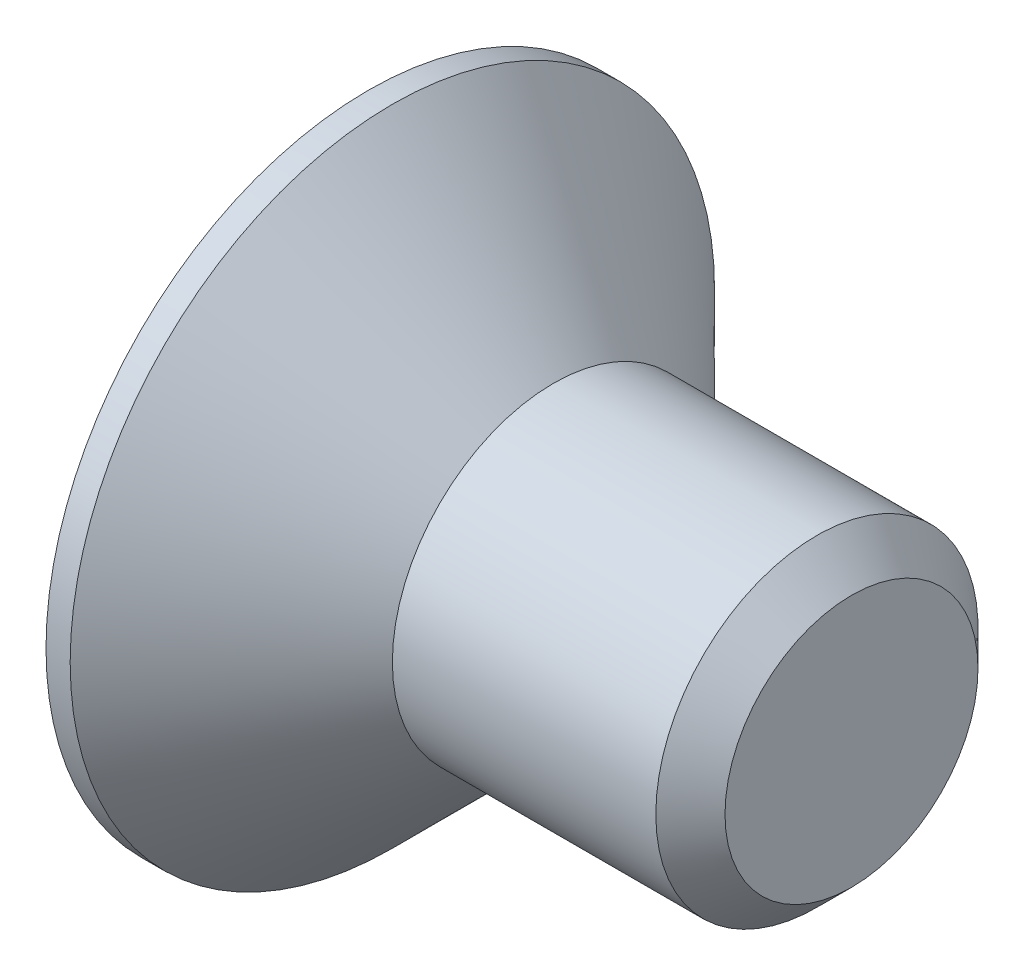
ISO-10303-21;
HEADER;
FILE_DESCRIPTION(('STEP AP214'),'2;1');
FILE_NAME('part.step','',(''),(''),'','','');
FILE_SCHEMA(('AUTOMOTIVE_DESIGN { 1 0 10303 214 1 1 1 1 }'));
ENDSEC;
DATA;
#1=APPLICATION_CONTEXT('core data for automotive mechanical design processes');
#2=APPLICATION_PROTOCOL_DEFINITION('international standard','automotive_design',2000,#1);
#3=PRODUCT_CONTEXT('',#1,'mechanical');
#4=PRODUCT('Part','Part','',(#3));
#5=PRODUCT_RELATED_PRODUCT_CATEGORY('part','',(#4));
#6=PRODUCT_DEFINITION_FORMATION('','',#4);
#7=PRODUCT_DEFINITION_CONTEXT('part definition',#1,'design');
#8=PRODUCT_DEFINITION('design','',#6,#7);
#9=PRODUCT_DEFINITION_SHAPE('','',#8);
#10=(LENGTH_UNIT() NAMED_UNIT(*) SI_UNIT(.MILLI.,.METRE.));
#11=(NAMED_UNIT(*) PLANE_ANGLE_UNIT() SI_UNIT($,.RADIAN.));
#12=(NAMED_UNIT(*) SI_UNIT($,.STERADIAN.) SOLID_ANGLE_UNIT());
#13=UNCERTAINTY_MEASURE_WITH_UNIT(LENGTH_MEASURE(1.E-05),#10,'distance_accuracy_value','');
#14=(GEOMETRIC_REPRESENTATION_CONTEXT(3) GLOBAL_UNCERTAINTY_ASSIGNED_CONTEXT((#13)) GLOBAL_UNIT_ASSIGNED_CONTEXT((#10,
#11,#12)) REPRESENTATION_CONTEXT('',''));
#15=CARTESIAN_POINT('',(0.,0.,0.));
#16=DIRECTION('',(0.,0.,1.));
#17=DIRECTION('',(1.,0.,0.));
#18=AXIS2_PLACEMENT_3D('',#15,#16,#17);
#19=CARTESIAN_POINT('',(3.7,0.,-0.785249999999998));
#20=DIRECTION('',(1.,0.,0.));
#21=DIRECTION('',(0.,0.,-1.));
#22=AXIS2_PLACEMENT_3D('',#19,#20,#21);
#23=PLANE('',#22);
#24=CARTESIAN_POINT('',(3.69999999998072,0.,0.));
#25=DIRECTION('',(-1.,0.,0.));
#26=DIRECTION('',(0.,0.,1.));
#27=AXIS2_PLACEMENT_3D('',#24,#25,#26);
#28=CIRCLE('',#27,1.57050000001391);
#29=CARTESIAN_POINT('',(3.69999999998072,0.,1.57050000001391));
#30=VERTEX_POINT('',#29);
#31=EDGE_CURVE('E19',#30,#30,#28,.T.);
#32=ORIENTED_EDGE('',*,*,#31,.F.);
#33=EDGE_LOOP('',(#32));
#34=FACE_BOUND('',#33,.T.);
#35=ADVANCED_FACE('F16',(#34),#23,.T.);
#36=CARTESIAN_POINT('',(-0.278312163288774,0.,3.41060513164848E-10));
#37=DIRECTION('',(-1.,0.,0.));
#38=DIRECTION('',(0.,0.,1.));
#39=AXIS2_PLACEMENT_3D('',#36,#37,#38);
#40=CONICAL_SURFACE('',#39,0.,1.04719755119332);
#41=CARTESIAN_POINT('',(-0.999999999665758,0.,3.41061389515031E-10));
#42=DIRECTION('',(-1.,0.,0.));
#43=DIRECTION('',(0.,0.,1.));
#44=AXIS2_PLACEMENT_3D('',#41,#42,#43);
#45=CIRCLE('',#44,1.24999999979992);
#46=CARTESIAN_POINT('',(-0.999999999616528,0.,1.24999999971465));
#47=VERTEX_POINT('',#46);
#48=CARTESIAN_POINT('',(-0.999999999764211,-1.08253175479159,0.625000000205777));
#49=VERTEX_POINT('',#48);
#50=EDGE_CURVE('E334',#47,#49,#45,.F.);
#51=ORIENTED_EDGE('',*,*,#50,.F.);
#52=CARTESIAN_POINT('',(-0.9999999995673,0.,3.41061389515031E-10));
#53=DIRECTION('',(-1.,0.,0.));
#54=DIRECTION('',(0.,0.,1.));
#55=AXIS2_PLACEMENT_3D('',#52,#53,#54);
#56=CIRCLE('',#55,1.24999999962939);
#57=CARTESIAN_POINT('',(-0.99999999978365,1.08253175465671,0.625000000127902));
#58=VERTEX_POINT('',#57);
#59=EDGE_CURVE('E290',#58,#47,#56,.F.);
#60=ORIENTED_EDGE('',*,*,#59,.F.);
#61=CARTESIAN_POINT('',(-0.999999999665758,0.,3.41061389515031E-10));
#62=DIRECTION('',(-1.,0.,0.));
#63=DIRECTION('',(0.,0.,1.));
#64=AXIS2_PLACEMENT_3D('',#61,#62,#63);
#65=CIRCLE('',#64,1.24999999979992);
#66=CARTESIAN_POINT('',(-0.999999999764213,1.08253175464391,-0.624999999779446));
#67=VERTEX_POINT('',#66);
#68=EDGE_CURVE('E329',#67,#58,#65,.F.);
#69=ORIENTED_EDGE('',*,*,#68,.F.);
#70=CARTESIAN_POINT('',(-0.999999999862667,0.,3.41061389515031E-10));
#71=DIRECTION('',(-1.,0.,0.));
#72=DIRECTION('',(0.,0.,1.));
#73=AXIS2_PLACEMENT_3D('',#70,#71,#72);
#74=CIRCLE('',#73,1.25000000014098);
#75=CARTESIAN_POINT('',(-0.999999999931333,0.,-1.24999999989995));
#76=VERTEX_POINT('',#75);
#77=EDGE_CURVE('E326',#76,#67,#74,.F.);
#78=ORIENTED_EDGE('',*,*,#77,.F.);
#79=CARTESIAN_POINT('',(-0.999999999961117,0.,3.41061389515031E-10));
#80=DIRECTION('',(-1.,0.,0.));
#81=DIRECTION('',(0.,0.,1.));
#82=AXIS2_PLACEMENT_3D('',#79,#80,#81);
#83=CIRCLE('',#82,1.2500000003115);
#84=CARTESIAN_POINT('',(-0.999999999911893,-1.08253175486543,-0.624999999907341));
#85=VERTEX_POINT('',#84);
#86=EDGE_CURVE('E327',#85,#76,#83,.F.);
#87=ORIENTED_EDGE('',*,*,#86,.F.);
#88=CARTESIAN_POINT('',(-0.999999999862666,0.,3.41061389515031E-10));
#89=DIRECTION('',(-1.,0.,0.));
#90=DIRECTION('',(0.,0.,1.));
#91=AXIS2_PLACEMENT_3D('',#88,#89,#90);
#92=CIRCLE('',#91,1.25000000014098);
#93=EDGE_CURVE('E75',#49,#85,#92,.F.);
#94=ORIENTED_EDGE('',*,*,#93,.F.);
#95=EDGE_LOOP('',(#51,#60,#69,#78,#87,#94));
#96=FACE_BOUND('',#95,.T.);
#97=CARTESIAN_POINT('',(-0.278312163374039,0.,2.27373675443232E-10));
#98=VERTEX_POINT('',#97);
#99=VERTEX_LOOP('',#98);
#100=FACE_BOUND('',#99,.T.);
#101=ADVANCED_FACE('F79',(#96,#100),#40,.F.);
#102=CARTESIAN_POINT('',(3.27050000009877,0.,0.));
#103=DIRECTION('',(-1.,0.,0.));
#104=DIRECTION('',(0.,0.,1.));
#105=AXIS2_PLACEMENT_3D('',#102,#103,#104);
#106=CONICAL_SURFACE('',#105,1.99999999989586,0.785398163397449);
#107=CARTESIAN_POINT('',(3.2705,0.,0.));
#108=DIRECTION('',(-1.,0.,0.));
#109=DIRECTION('',(0.,0.,1.));
#110=AXIS2_PLACEMENT_3D('',#107,#108,#109);
#111=CIRCLE('',#110,2.);
#112=CARTESIAN_POINT('',(3.2705,0.,2.));
#113=VERTEX_POINT('',#112);
#114=EDGE_CURVE('E220',#113,#113,#111,.T.);
#115=ORIENTED_EDGE('',*,*,#114,.F.);
#116=EDGE_LOOP('',(#115));
#117=FACE_BOUND('',#116,.T.);
#118=ORIENTED_EDGE('',*,*,#31,.T.);
#119=EDGE_LOOP('',(#118));
#120=FACE_BOUND('',#119,.T.);
#121=ADVANCED_FACE('F81',(#117,#120),#106,.T.);
#122=CARTESIAN_POINT('',(-1.,0.,0.));
#123=DIRECTION('',(-1.,0.,0.));
#124=DIRECTION('',(0.,0.,1.));
#125=AXIS2_PLACEMENT_3D('',#122,#123,#124);
#126=PLANE('',#125);
#127=DIRECTION('',(0.,0.5,-0.866025403784439));
#128=VECTOR('',#127,1.);
#129=CARTESIAN_POINT('',(-1.,-0.721687836487032,-1.24999999999999));
#130=LINE('',#129,#128);
#131=CARTESIAN_POINT('',(-1.,-1.44337567297406,0.));
#132=VERTEX_POINT('',#131);
#133=EDGE_CURVE('E205',#85,#132,#130,.F.);
#134=ORIENTED_EDGE('',*,*,#133,.T.);
#135=DIRECTION('',(0.,-0.5,-0.866025403784439));
#136=VECTOR('',#135,1.);
#137=CARTESIAN_POINT('',(-1.,-1.44337567297406,0.));
#138=LINE('',#137,#136);
#139=EDGE_CURVE('E207',#132,#49,#138,.F.);
#140=ORIENTED_EDGE('',*,*,#139,.T.);
#141=ORIENTED_EDGE('',*,*,#93,.T.);
#142=EDGE_LOOP('',(#134,#140,#141));
#143=FACE_BOUND('',#142,.T.);
#144=ADVANCED_FACE('F87',(#143),#126,.T.);
#145=CARTESIAN_POINT('',(-1.,0.,0.));
#146=DIRECTION('',(-1.,0.,0.));
#147=DIRECTION('',(0.,0.,1.));
#148=AXIS2_PLACEMENT_3D('',#145,#146,#147);
#149=PLANE('',#148);
#150=DIRECTION('',(0.,1.,0.));
#151=VECTOR('',#150,1.);
#152=CARTESIAN_POINT('',(-1.,0.721687836487032,-1.24999999999999));
#153=LINE('',#152,#151);
#154=CARTESIAN_POINT('',(-1.,-0.721687836487032,-1.24999999999999));
#155=VERTEX_POINT('',#154);
#156=EDGE_CURVE('E227',#76,#155,#153,.F.);
#157=ORIENTED_EDGE('',*,*,#156,.T.);
#158=DIRECTION('',(0.,0.5,-0.866025403784439));
#159=VECTOR('',#158,1.);
#160=CARTESIAN_POINT('',(-1.,-0.721687836487032,-1.24999999999999));
#161=LINE('',#160,#159);
#162=EDGE_CURVE('E212',#155,#85,#161,.F.);
#163=ORIENTED_EDGE('',*,*,#162,.T.);
#164=ORIENTED_EDGE('',*,*,#86,.T.);
#165=EDGE_LOOP('',(#157,#163,#164));
#166=FACE_BOUND('',#165,.T.);
#167=ADVANCED_FACE('F194',(#166),#149,.T.);
#168=CARTESIAN_POINT('',(-1.,0.,0.));
#169=DIRECTION('',(-1.,0.,0.));
#170=DIRECTION('',(0.,0.,1.));
#171=AXIS2_PLACEMENT_3D('',#168,#169,#170);
#172=PLANE('',#171);
#173=DIRECTION('',(0.,0.5,0.866025403784439));
#174=VECTOR('',#173,1.);
#175=CARTESIAN_POINT('',(-1.,1.44337567297406,0.));
#176=LINE('',#175,#174);
#177=CARTESIAN_POINT('',(-1.,0.721687836487032,-1.24999999999999));
#178=VERTEX_POINT('',#177);
#179=EDGE_CURVE('E262',#67,#178,#176,.F.);
#180=ORIENTED_EDGE('',*,*,#179,.T.);
#181=DIRECTION('',(0.,1.,0.));
#182=VECTOR('',#181,1.);
#183=CARTESIAN_POINT('',(-1.,0.721687836487032,-1.24999999999999));
#184=LINE('',#183,#182);
#185=EDGE_CURVE('E224',#178,#76,#184,.F.);
#186=ORIENTED_EDGE('',*,*,#185,.T.);
#187=ORIENTED_EDGE('',*,*,#77,.T.);
#188=EDGE_LOOP('',(#180,#186,#187));
#189=FACE_BOUND('',#188,.T.);
#190=ADVANCED_FACE('F190',(#189),#172,.T.);
#191=CARTESIAN_POINT('',(-1.,0.,0.));
#192=DIRECTION('',(-1.,0.,0.));
#193=DIRECTION('',(0.,0.,1.));
#194=AXIS2_PLACEMENT_3D('',#191,#192,#193);
#195=PLANE('',#194);
#196=DIRECTION('',(0.,-0.5,0.866025403784439));
#197=VECTOR('',#196,1.);
#198=CARTESIAN_POINT('',(-1.,0.721687836487032,1.25000000000001));
#199=LINE('',#198,#197);
#200=CARTESIAN_POINT('',(-1.,1.44337567297406,0.));
#201=VERTEX_POINT('',#200);
#202=EDGE_CURVE('E241',#58,#201,#199,.F.);
#203=ORIENTED_EDGE('',*,*,#202,.T.);
#204=DIRECTION('',(0.,0.5,0.866025403784439));
#205=VECTOR('',#204,1.);
#206=CARTESIAN_POINT('',(-1.,1.44337567297406,0.));
#207=LINE('',#206,#205);
#208=EDGE_CURVE('E259',#201,#67,#207,.F.);
#209=ORIENTED_EDGE('',*,*,#208,.T.);
#210=ORIENTED_EDGE('',*,*,#68,.T.);
#211=EDGE_LOOP('',(#203,#209,#210));
#212=FACE_BOUND('',#211,.T.);
#213=ADVANCED_FACE('F186',(#212),#195,.T.);
#214=CARTESIAN_POINT('',(-1.,0.,0.));
#215=DIRECTION('',(-1.,0.,0.));
#216=DIRECTION('',(0.,0.,1.));
#217=AXIS2_PLACEMENT_3D('',#214,#215,#216);
#218=PLANE('',#217);
#219=DIRECTION('',(0.,-0.5,-0.866025403784439));
#220=VECTOR('',#219,1.);
#221=CARTESIAN_POINT('',(-1.,-1.44337567297406,0.));
#222=LINE('',#221,#220);
#223=CARTESIAN_POINT('',(-1.,-0.721687836487032,1.25000000000001));
#224=VERTEX_POINT('',#223);
#225=EDGE_CURVE('E219',#49,#224,#222,.F.);
#226=ORIENTED_EDGE('',*,*,#225,.T.);
#227=DIRECTION('',(0.,1.,0.));
#228=VECTOR('',#227,1.);
#229=CARTESIAN_POINT('',(-1.,-0.721687836487032,1.25000000000001));
#230=LINE('',#229,#228);
#231=EDGE_CURVE('E248',#224,#47,#230,.T.);
#232=ORIENTED_EDGE('',*,*,#231,.T.);
#233=ORIENTED_EDGE('',*,*,#50,.T.);
#234=EDGE_LOOP('',(#226,#232,#233));
#235=FACE_BOUND('',#234,.T.);
#236=ADVANCED_FACE('F182',(#235),#218,.T.);
#237=CARTESIAN_POINT('',(-1.,0.,0.));
#238=DIRECTION('',(-1.,0.,0.));
#239=DIRECTION('',(0.,0.,1.));
#240=AXIS2_PLACEMENT_3D('',#237,#238,#239);
#241=PLANE('',#240);
#242=DIRECTION('',(0.,1.,0.));
#243=VECTOR('',#242,1.);
#244=CARTESIAN_POINT('',(-1.,-0.721687836487032,1.25000000000001));
#245=LINE('',#244,#243);
#246=CARTESIAN_POINT('',(-1.,0.721687836487032,1.25000000000001));
#247=VERTEX_POINT('',#246);
#248=EDGE_CURVE('E245',#47,#247,#245,.T.);
#249=ORIENTED_EDGE('',*,*,#248,.T.);
#250=DIRECTION('',(0.,-0.5,0.866025403784439));
#251=VECTOR('',#250,1.);
#252=CARTESIAN_POINT('',(-1.,0.721687836487032,1.25000000000001));
#253=LINE('',#252,#251);
#254=EDGE_CURVE('E238',#247,#58,#253,.F.);
#255=ORIENTED_EDGE('',*,*,#254,.T.);
#256=ORIENTED_EDGE('',*,*,#59,.T.);
#257=EDGE_LOOP('',(#249,#255,#256));
#258=FACE_BOUND('',#257,.T.);
#259=ADVANCED_FACE('F178',(#258),#241,.T.);
#260=CARTESIAN_POINT('',(1.63525,0.,0.));
#261=DIRECTION('',(-1.,0.,0.));
#262=DIRECTION('',(0.,0.,1.));
#263=AXIS2_PLACEMENT_3D('',#260,#261,#262);
#264=CYLINDRICAL_SURFACE('',#263,2.);
#265=CARTESIAN_POINT('',(5.6846020946022E-11,0.,0.));
#266=DIRECTION('',(-1.,0.,0.));
#267=DIRECTION('',(0.,0.,-1.));
#268=AXIS2_PLACEMENT_3D('',#265,#266,#267);
#269=CIRCLE('',#268,2.00000000000955);
#270=CARTESIAN_POINT('',(5.6843418860808E-11,0.,-2.00000000000955));
#271=VERTEX_POINT('',#270);
#272=EDGE_CURVE('E235',#271,#271,#269,.T.);
#273=ORIENTED_EDGE('',*,*,#272,.F.);
#274=EDGE_LOOP('',(#273));
#275=FACE_BOUND('',#274,.T.);
#276=ORIENTED_EDGE('',*,*,#114,.T.);
#277=EDGE_LOOP('',(#276));
#278=FACE_BOUND('',#277,.T.);
#279=ADVANCED_FACE('F174',(#275,#278),#264,.T.);
#280=CARTESIAN_POINT('',(-2.3,-1.44337567297406,0.));
#281=DIRECTION('',(0.,-0.866025403784439,0.5));
#282=DIRECTION('',(0.,-0.5,-0.866025403784439));
#283=AXIS2_PLACEMENT_3D('',#280,#281,#282);
#284=PLANE('',#283);
#285=DIRECTION('',(1.,0.,0.));
#286=VECTOR('',#285,1.);
#287=CARTESIAN_POINT('',(-2.3,-0.721687836487032,1.25000000000001));
#288=LINE('',#287,#286);
#289=CARTESIAN_POINT('',(-1.7862688953895,-0.721687832956952,1.25000000611428));
#290=VERTEX_POINT('',#289);
#291=EDGE_CURVE('E253',#290,#224,#288,.T.);
#292=ORIENTED_EDGE('',*,*,#291,.T.);
#293=ORIENTED_EDGE('',*,*,#225,.F.);
#294=ORIENTED_EDGE('',*,*,#139,.F.);
#295=DIRECTION('',(1.,0.,0.));
#296=VECTOR('',#295,1.);
#297=CARTESIAN_POINT('',(-2.3,-1.44337567297406,0.));
#298=LINE('',#297,#296);
#299=CARTESIAN_POINT('',(-1.7862688953895,-1.44337567650414,6.11428520817276E-09));
#300=VERTEX_POINT('',#299);
#301=EDGE_CURVE('E211',#132,#300,#298,.F.);
#302=ORIENTED_EDGE('',*,*,#301,.T.);
#303=CARTESIAN_POINT('',(-1.78626891235077,-0.721687806261489,1.24999999109952));
#304=CARTESIAN_POINT('',(-1.76164917652909,-0.746330541457944,1.20731756090093));
#305=CARTESIAN_POINT('',(-1.73846699513202,-0.771382668611239,1.16392601996234));
#306=CARTESIAN_POINT('',(-1.69597359225583,-0.822475988425117,1.07542980600521));
#307=CARTESIAN_POINT('',(-1.6766881475918,-0.848522493485841,1.03031593150843));
#308=CARTESIAN_POINT('',(-1.64338632843081,-0.901368294266138,0.938784316413887));
#309=CARTESIAN_POINT('',(-1.62935212170305,-0.928164703979337,0.892371574506768));
#310=CARTESIAN_POINT('',(-1.6077458535116,-0.982344945584174,0.798528644097361));
#311=CARTESIAN_POINT('',(-1.60015380883428,-1.00972668885013,0.751102073205651));
#312=CARTESIAN_POINT('',(-1.59508218577652,-1.04476213376217,0.690418902485495));
#313=CARTESIAN_POINT('',(-1.59426226287314,-1.05231226989246,0.677341683112202));
#314=CARTESIAN_POINT('',(-1.59316768019177,-1.06741850292953,0.651176919992883));
#315=CARTESIAN_POINT('',(-1.59289272421091,-1.0749745943639,0.638089385725326));
#316=CARTESIAN_POINT('',(-1.59289446041299,-1.10149873797063,0.592148221375791));
#317=CARTESIAN_POINT('',(-1.5946307961109,-1.12047245455786,0.5592847802282));
#318=CARTESIAN_POINT('',(-1.60147301863794,-1.15827190309586,0.493814214854671));
#319=CARTESIAN_POINT('',(-1.6065812556481,-1.17709752255694,0.461207285466605));
#320=CARTESIAN_POINT('',(-1.62664446949028,-1.23332348790944,0.36382105677545));
#321=CARTESIAN_POINT('',(-1.64633454610782,-1.27031406304779,0.299751501232598));
#322=CARTESIAN_POINT('',(-1.68661536692262,-1.33006607514146,0.196257980430864));
#323=CARTESIAN_POINT('',(-1.70452688398322,-1.3533142965625,0.155990879744222));
#324=CARTESIAN_POINT('',(-1.74334692004905,-1.39893045654793,0.0769813730036699));
#325=CARTESIAN_POINT('',(-1.76422652848417,-1.42130450171474,0.0382283900041067));
#326=CARTESIAN_POINT('',(-1.78626885647072,-1.44337563758536,6.1295040458712E-08));
#327=B_SPLINE_CURVE_WITH_KNOTS('',3,(#303,#304,#305,#306,#307,#308,#309,#310,#311,#312,#313,
#314,#315,#316,#317,#318,#319,#320,#321,#322,#323,#324,#325,#326),.UNSPECIFIED.,.F.,.F.,(4,2,2,
2,2,2,2,2,2,2,2,4),(0.,0.165391499196229,0.3318436122377,0.497725241331166,0.663090414357996,
0.708451150265425,0.75378722473374,0.867571837228315,0.981435840302691,1.21010448822637,
1.35949055859956,1.50751026739989),.UNSPECIFIED.);
#328=EDGE_CURVE('E129',#290,#300,#327,.T.);
#329=ORIENTED_EDGE('',*,*,#328,.F.);
#330=EDGE_LOOP('',(#292,#293,#294,#302,#329));
#331=FACE_BOUND('',#330,.T.);
#332=ADVANCED_FACE('F169',(#331),#284,.F.);
#333=CARTESIAN_POINT('',(-2.3,-0.721687836487032,-1.24999999999999));
#334=DIRECTION('',(0.,-0.866025403784439,-0.5));
#335=DIRECTION('',(0.,0.5,-0.866025403784439));
#336=AXIS2_PLACEMENT_3D('',#333,#334,#335);
#337=PLANE('',#336);
#338=ORIENTED_EDGE('',*,*,#301,.F.);
#339=ORIENTED_EDGE('',*,*,#133,.F.);
#340=ORIENTED_EDGE('',*,*,#162,.F.);
#341=DIRECTION('',(-1.,0.,0.));
#342=VECTOR('',#341,1.);
#343=CARTESIAN_POINT('',(-2.3,-0.721687836487032,-1.24999999999999));
#344=LINE('',#343,#342);
#345=CARTESIAN_POINT('',(-1.78626889538877,-0.721687843545721,-1.24999999999999));
#346=VERTEX_POINT('',#345);
#347=EDGE_CURVE('E263',#155,#346,#344,.T.);
#348=ORIENTED_EDGE('',*,*,#347,.T.);
#349=CARTESIAN_POINT('',(-1.78626891235077,-1.44337565015324,2.1725850671279E-08));
#350=CARTESIAN_POINT('',(-1.76164917652909,-1.41873294890424,-0.0426824280723059));
#351=CARTESIAN_POINT('',(-1.73846699513202,-1.39368083571871,-0.0860739770751915));
#352=CARTESIAN_POINT('',(-1.69597359225583,-1.34258752620003,-0.174570196976257));
#353=CARTESIAN_POINT('',(-1.6766881475918,-1.31654101735304,-0.219684069287033));
#354=CARTESIAN_POINT('',(-1.64338632843081,-1.2636952138219,-0.311215682793371));
#355=CARTESIAN_POINT('',(-1.62935212170305,-1.23689880512764,-0.357628425288778));
#356=CARTESIAN_POINT('',(-1.6077458535116,-1.18271856422994,-0.45147135610645));
#357=CARTESIAN_POINT('',(-1.60015380883428,-1.15533682065631,-0.498897926820523));
#358=CARTESIAN_POINT('',(-1.59508218577652,-1.12030137568649,-0.559581097507324));
#359=CARTESIAN_POINT('',(-1.59426226287314,-1.1127512395635,-0.572658316884833));
#360=CARTESIAN_POINT('',(-1.59316768019177,-1.0976450065367,-0.598823080010078));
#361=CARTESIAN_POINT('',(-1.59289272421091,-1.09008891510529,-0.611910614279346));
#362=CARTESIAN_POINT('',(-1.59289446041299,-1.06356477150252,-0.657851778631162));
#363=CARTESIAN_POINT('',(-1.5946307961109,-1.04459105490654,-0.690715219773703));
#364=CARTESIAN_POINT('',(-1.60147301863794,-1.00679160636194,-0.75618578514342));
#365=CARTESIAN_POINT('',(-1.6065812556481,-0.987965986903009,-0.788792714532729));
#366=CARTESIAN_POINT('',(-1.62664446949028,-0.931740021553957,-0.886178943225876));
#367=CARTESIAN_POINT('',(-1.64633454610782,-0.894749446413843,-0.950248498767708));
#368=CARTESIAN_POINT('',(-1.68661536692279,-0.834997434319028,-1.05374201956938));
#369=CARTESIAN_POINT('',(-1.70452688398361,-0.811749212897918,-1.09400912025655));
#370=CARTESIAN_POINT('',(-1.74334692004993,-0.766133052912357,-1.17301862699813));
#371=CARTESIAN_POINT('',(-1.76422652848532,-0.743759007745485,-1.2117716099982));
#372=CARTESIAN_POINT('',(-1.78626885647216,-0.721687871874297,-1.24999993870745));
#373=B_SPLINE_CURVE_WITH_KNOTS('',3,(#349,#350,#351,#352,#353,#354,#355,#356,#357,#358,#359,
#360,#361,#362,#363,#364,#365,#366,#367,#368,#369,#370,#371,#372),.UNSPECIFIED.,.F.,.F.,(4,2,2,
2,2,2,2,2,2,2,2,4),(0.,0.165391499196225,0.331843612237694,0.497725241331163,0.663090414357996,
0.708451150265425,0.75378722473374,0.867571837228312,0.981435840302686,1.21010448822637,
1.35949055860118,1.5075102674031),.UNSPECIFIED.);
#374=EDGE_CURVE('E122',#300,#346,#373,.T.);
#375=ORIENTED_EDGE('',*,*,#374,.F.);
#376=EDGE_LOOP('',(#338,#339,#340,#348,#375));
#377=FACE_BOUND('',#376,.T.);
#378=ADVANCED_FACE('F165',(#377),#337,.F.);
#379=CARTESIAN_POINT('',(-2.3,0.721687836487032,-1.24999999999999));
#380=DIRECTION('',(0.,0.,-1.));
#381=DIRECTION('',(-1.,0.,0.));
#382=AXIS2_PLACEMENT_3D('',#379,#380,#381);
#383=PLANE('',#382);
#384=ORIENTED_EDGE('',*,*,#347,.F.);
#385=ORIENTED_EDGE('',*,*,#156,.F.);
#386=ORIENTED_EDGE('',*,*,#185,.F.);
#387=DIRECTION('',(1.,0.,0.));
#388=VECTOR('',#387,1.);
#389=CARTESIAN_POINT('',(-2.3,0.721687836487032,-1.24999999999999));
#390=LINE('',#389,#388);
#391=CARTESIAN_POINT('',(-1.78626889538886,0.721687832957594,-1.25000000611316));
#392=VERTEX_POINT('',#391);
#393=EDGE_CURVE('E242',#178,#392,#390,.F.);
#394=ORIENTED_EDGE('',*,*,#393,.T.);
#395=CARTESIAN_POINT('',(-1.78626891234884,-0.721687843889044,-1.24999996937472));
#396=CARTESIAN_POINT('',(-1.76164917652706,-0.672402407442678,-1.24999998897384));
#397=CARTESIAN_POINT('',(-1.7384669951299,-0.622298167103004,-1.24999999703774));
#398=CARTESIAN_POINT('',(-1.69597359225367,-0.520111537769072,-1.25000000298124));
#399=CARTESIAN_POINT('',(-1.67668814758966,-0.468018523860847,-1.2500000007952));
#400=CARTESIAN_POINT('',(-1.64338632842909,-0.362326919549872,-1.24999999920751));
#401=CARTESIAN_POINT('',(-1.62935212170158,-0.308734101143437,-1.24999999979635));
#402=CARTESIAN_POINT('',(-1.60774585351151,-0.200373618642824,-1.250000000203));
#403=CARTESIAN_POINT('',(-1.60015380883532,-0.145610131804148,-1.25000000002319));
#404=CARTESIAN_POINT('',(-1.59508218577613,-0.0755392419234385,-1.24999999999363));
#405=CARTESIAN_POINT('',(-1.59426226287227,-0.0604389696703764,-1.24999999999905));
#406=CARTESIAN_POINT('',(-1.5931676801926,-0.0302265036068779,-1.25000000000093));
#407=CARTESIAN_POINT('',(-1.59289272421392,-0.0151143207412336,-1.2499999999974));
#408=CARTESIAN_POINT('',(-1.59289446041955,0.0379339664684823,-1.24999999999111));
#409=CARTESIAN_POINT('',(-1.59463079611274,0.075881399652056,-1.24999999999756));
#410=CARTESIAN_POINT('',(-1.60147301863627,0.151480296735002,-1.25000000000243));
#411=CARTESIAN_POINT('',(-1.60658125564763,0.189131535654985,-1.25000000000084));
#412=CARTESIAN_POINT('',(-1.62664446949173,0.301583466356215,-1.2499999999983));
#413=CARTESIAN_POINT('',(-1.64633454610826,0.375564616634415,-1.2499999999996));
#414=CARTESIAN_POINT('',(-1.68661536692256,0.49506864082257,-1.25000000000025));
#415=CARTESIAN_POINT('',(-1.70452688398335,0.541565083664637,-1.25000000000012));
#416=CARTESIAN_POINT('',(-1.74334692004973,0.632797403635924,-1.24999999999987));
#417=CARTESIAN_POINT('',(-1.76422652848526,0.677545493969972,-1.24999999999974));
#418=CARTESIAN_POINT('',(-1.78626885647198,0.721687765712137,-1.24999999999999));
#419=B_SPLINE_CURVE_WITH_KNOTS('',3,(#395,#396,#397,#398,#399,#400,#401,#402,#403,#404,#405,
#406,#407,#408,#409,#410,#411,#412,#413,#414,#415,#416,#417,#418),.UNSPECIFIED.,.F.,.F.,(4,2,2,
2,2,2,2,2,2,2,2,4),(0.,0.16539149919871,0.331843612241636,0.497725241331789,0.663090414355827,
0.708451150262623,0.7537872247304,0.867571837225856,0.981435840300213,1.21010448822308,
1.35949055859683,1.50751026739918),.UNSPECIFIED.);
#420=EDGE_CURVE('E113',#346,#392,#419,.T.);
#421=ORIENTED_EDGE('',*,*,#420,.F.);
#422=EDGE_LOOP('',(#384,#385,#386,#394,#421));
#423=FACE_BOUND('',#422,.T.);
#424=ADVANCED_FACE('F161',(#423),#383,.F.);
#425=CARTESIAN_POINT('',(-2.3,1.44337567297406,0.));
#426=DIRECTION('',(0.,0.866025403784439,-0.5));
#427=DIRECTION('',(0.,0.5,0.866025403784439));
#428=AXIS2_PLACEMENT_3D('',#425,#426,#427);
#429=PLANE('',#428);
#430=ORIENTED_EDGE('',*,*,#393,.F.);
#431=ORIENTED_EDGE('',*,*,#179,.F.);
#432=ORIENTED_EDGE('',*,*,#208,.F.);
#433=DIRECTION('',(1.,0.,0.));
#434=VECTOR('',#433,1.);
#435=CARTESIAN_POINT('',(-2.3,1.44337567297406,0.));
#436=LINE('',#435,#434);
#437=CARTESIAN_POINT('',(-1.78626889538877,1.44337567650341,-6.11299656366819E-09));
#438=VERTEX_POINT('',#437);
#439=EDGE_CURVE('E268',#201,#438,#436,.F.);
#440=ORIENTED_EDGE('',*,*,#439,.T.);
#441=CARTESIAN_POINT('',(-1.78626891234909,0.721687806263474,-1.24999999109792));
#442=CARTESIAN_POINT('',(-1.76164917652779,0.746330541459416,-1.20731756089903));
#443=CARTESIAN_POINT('',(-1.73846699513095,0.771382668612463,-1.16392601996038));
#444=CARTESIAN_POINT('',(-1.69597359225509,0.822475988426077,-1.07542980600335));
#445=CARTESIAN_POINT('',(-1.67668814759114,0.848522493486787,-1.03031593150672));
#446=CARTESIAN_POINT('',(-1.64338632843034,0.90136829426699,-0.938784316412445));
#447=CARTESIAN_POINT('',(-1.62935212170268,0.928164703980108,-0.89237157450543));
#448=CARTESIAN_POINT('',(-1.60774585351141,0.982344945584796,-0.798528644096257));
#449=CARTESIAN_POINT('',(-1.60015380883416,1.00972668885068,-0.751102073204678));
#450=CARTESIAN_POINT('',(-1.59508218577647,1.04476213376257,-0.69041890248479));
#451=CARTESIAN_POINT('',(-1.59426226287311,1.05231226989278,-0.677341683111636));
#452=CARTESIAN_POINT('',(-1.59316768019176,1.06741850292969,-0.651176919992593));
#453=CARTESIAN_POINT('',(-1.59289272421091,1.07497459436398,-0.638089385725174));
#454=CARTESIAN_POINT('',(-1.59289446041299,1.10149873797063,-0.592148221375779));
#455=CARTESIAN_POINT('',(-1.5946307961109,1.12047245455785,-0.559284780228188));
#456=CARTESIAN_POINT('',(-1.60147301863794,1.15827190309586,-0.49381421485466));
#457=CARTESIAN_POINT('',(-1.6065812556481,1.17709752255694,-0.461207285466595));
#458=CARTESIAN_POINT('',(-1.62664446949028,1.23332348790944,-0.363821056775439));
#459=CARTESIAN_POINT('',(-1.64633454610782,1.27031406304779,-0.299751501232587));
#460=CARTESIAN_POINT('',(-1.68661536692279,1.33006607514172,-0.196257980430407));
#461=CARTESIAN_POINT('',(-1.70452688398361,1.353314296563,-0.155990879743333));
#462=CARTESIAN_POINT('',(-1.74334692004993,1.39893045654891,-0.0769813730019511));
#463=CARTESIAN_POINT('',(-1.76422652848531,1.42130450171595,-0.0382283900019886));
#464=CARTESIAN_POINT('',(-1.78626885647216,1.4433756375868,-6.12925339774599E-08));
#465=B_SPLINE_CURVE_WITH_KNOTS('',3,(#441,#442,#443,#444,#445,#446,#447,#448,#449,#450,#451,
#452,#453,#454,#455,#456,#457,#458,#459,#460,#461,#462,#463,#464),.UNSPECIFIED.,.F.,.F.,(4,2,2,
2,2,2,2,2,2,2,2,4),(0.,0.165391499195738,0.331843612236726,0.497725241329732,0.663090414356101,
0.708451150263049,0.753787224730885,0.867571837225457,0.981435840299831,1.21010448822352,
1.35949055859832,1.50751026740025),.UNSPECIFIED.);
#466=EDGE_CURVE('E148',#392,#438,#465,.T.);
#467=ORIENTED_EDGE('',*,*,#466,.F.);
#468=EDGE_LOOP('',(#430,#431,#432,#440,#467));
#469=FACE_BOUND('',#468,.T.);
#470=ADVANCED_FACE('F157',(#469),#429,.F.);
#471=CARTESIAN_POINT('',(-2.3,0.721687836487032,1.25000000000001));
#472=DIRECTION('',(0.,0.866025403784439,0.5));
#473=DIRECTION('',(0.,-0.5,0.866025403784439));
#474=AXIS2_PLACEMENT_3D('',#471,#472,#473);
#475=PLANE('',#474);
#476=ORIENTED_EDGE('',*,*,#439,.F.);
#477=ORIENTED_EDGE('',*,*,#202,.F.);
#478=ORIENTED_EDGE('',*,*,#254,.F.);
#479=DIRECTION('',(1.,0.,0.));
#480=VECTOR('',#479,1.);
#481=CARTESIAN_POINT('',(-2.3,0.721687836487032,1.25000000000001));
#482=LINE('',#481,#480);
#483=CARTESIAN_POINT('',(-1.78626889538913,0.721687843546455,1.25000000000001));
#484=VERTEX_POINT('',#483);
#485=EDGE_CURVE('E34',#247,#484,#482,.F.);
#486=ORIENTED_EDGE('',*,*,#485,.T.);
#487=CARTESIAN_POINT('',(-1.78626891234884,1.44337565015281,-2.1722959055229E-08));
#488=CARTESIAN_POINT('',(-1.7616491765276,1.41873294890321,0.0426824280748603));
#489=CARTESIAN_POINT('',(-1.7384669951308,1.39368083571749,0.0860739770775353));
#490=CARTESIAN_POINT('',(-1.69597359225498,1.34258752619875,0.174570196978286));
#491=CARTESIAN_POINT('',(-1.67668814759104,1.31654101735191,0.21968406928896));
#492=CARTESIAN_POINT('',(-1.64338632843027,1.26369521382097,0.311215682795055));
#493=CARTESIAN_POINT('',(-1.62935212170263,1.23689880512677,0.357628425290321));
#494=CARTESIAN_POINT('',(-1.60774585351138,1.18271856422921,0.451471356107708));
#495=CARTESIAN_POINT('',(-1.60015380883414,1.15533682065568,0.498897926821636));
#496=CARTESIAN_POINT('',(-1.59508218577647,1.12030137568603,0.559581097508129));
#497=CARTESIAN_POINT('',(-1.5942622628731,1.11275123956314,0.57265831688548));
#498=CARTESIAN_POINT('',(-1.59316768019176,1.09764500653652,0.598823080010409));
#499=CARTESIAN_POINT('',(-1.59289272421091,1.0900889151052,0.611910614279519));
#500=CARTESIAN_POINT('',(-1.59289446041299,1.06356477150252,0.657851778631176));
#501=CARTESIAN_POINT('',(-1.5946307961109,1.04459105490654,0.690715219773717));
#502=CARTESIAN_POINT('',(-1.60147301863794,1.00679160636194,0.756185785143434));
#503=CARTESIAN_POINT('',(-1.6065812556481,0.987965986903009,0.788792714532744));
#504=CARTESIAN_POINT('',(-1.62664446949028,0.931740021553957,0.886178943225891));
#505=CARTESIAN_POINT('',(-1.64633454610782,0.894749446413843,0.950248498767723));
#506=CARTESIAN_POINT('',(-1.6866153669227,0.834997434319156,1.05374201956917));
#507=CARTESIAN_POINT('',(-1.70452688398341,0.81174921289817,1.09400912025613));
#508=CARTESIAN_POINT('',(-1.74334692004949,0.766133052912849,1.1730186269973));
#509=CARTESIAN_POINT('',(-1.76422652848474,0.743759007746091,1.21177160999716));
#510=CARTESIAN_POINT('',(-1.78626885647144,0.721687871875016,1.24999993870622));
#511=B_SPLINE_CURVE_WITH_KNOTS('',3,(#487,#488,#489,#490,#491,#492,#493,#494,#495,#496,#497,
#498,#499,#500,#501,#502,#503,#504,#505,#506,#507,#508,#509,#510),.UNSPECIFIED.,.F.,.F.,(4,2,2,
2,2,2,2,2,2,2,2,4),(0.,0.165391499195669,0.331843612236588,0.497725241329525,0.663090414355823,
0.708451150262702,0.753787224730469,0.867571837225042,0.981435840299417,1.2101044882231,
1.3594905585971,1.50751026739823),.UNSPECIFIED.);
#512=EDGE_CURVE('E142',#438,#484,#511,.T.);
#513=ORIENTED_EDGE('',*,*,#512,.F.);
#514=EDGE_LOOP('',(#476,#477,#478,#486,#513));
#515=FACE_BOUND('',#514,.T.);
#516=ADVANCED_FACE('F153',(#515),#475,.F.);
#517=CARTESIAN_POINT('',(-2.3,-0.721687836487032,1.25000000000001));
#518=DIRECTION('',(0.,0.,1.));
#519=DIRECTION('',(1.,0.,0.));
#520=AXIS2_PLACEMENT_3D('',#517,#518,#519);
#521=PLANE('',#520);
#522=ORIENTED_EDGE('',*,*,#485,.F.);
#523=ORIENTED_EDGE('',*,*,#248,.F.);
#524=ORIENTED_EDGE('',*,*,#231,.F.);
#525=ORIENTED_EDGE('',*,*,#291,.F.);
#526=CARTESIAN_POINT('',(-1.7862689123498,0.721687843890396,1.24999996937421));
#527=CARTESIAN_POINT('',(-1.76164917652804,0.672402407444438,1.24999998897356));
#528=CARTESIAN_POINT('',(-1.73846699513091,0.622298167105145,1.24999999703765));
#529=CARTESIAN_POINT('',(-1.69597359225469,0.520111537771821,1.25000000298136));
#530=CARTESIAN_POINT('',(-1.67668814759066,0.468018523863817,1.25000000079533));
#531=CARTESIAN_POINT('',(-1.64338632842989,0.362326919552618,1.24999999920741));
#532=CARTESIAN_POINT('',(-1.62935212170226,0.308734101145716,1.249999999796));
#533=CARTESIAN_POINT('',(-1.60774585351156,0.200373618644219,1.25000000020338));
#534=CARTESIAN_POINT('',(-1.60015380883485,0.145610131805127,1.25000000002455));
#535=CARTESIAN_POINT('',(-1.59508218577631,0.0755392419239006,1.24999999999328));
#536=CARTESIAN_POINT('',(-1.59426226287266,0.060438969670754,1.24999999999815));
#537=CARTESIAN_POINT('',(-1.59316768019222,0.030226503607117,1.25000000000186));
#538=CARTESIAN_POINT('',(-1.59289272421256,0.0151143207414187,1.2500000000007));
#539=CARTESIAN_POINT('',(-1.59289446041659,-0.0379339664682036,1.24999999999828));
#540=CARTESIAN_POINT('',(-1.5946307961119,-0.0758813996516298,1.24999999999953));
#541=CARTESIAN_POINT('',(-1.60147301863702,-0.151480296734463,1.25000000000048));
#542=CARTESIAN_POINT('',(-1.60658125564784,-0.189131535654479,1.25000000000017));
#543=CARTESIAN_POINT('',(-1.62664446949108,-0.301583466355911,1.24999999999968));
#544=CARTESIAN_POINT('',(-1.64633454610808,-0.375564616634266,1.24999999999993));
#545=CARTESIAN_POINT('',(-1.68661536692253,-0.495068640822227,1.25000000000006));
#546=CARTESIAN_POINT('',(-1.70452688398313,-0.541565083663963,1.25000000000003));
#547=CARTESIAN_POINT('',(-1.74334692004902,-0.632797403634408,1.24999999999998));
#548=CARTESIAN_POINT('',(-1.76422652848422,-0.677545493967952,1.24999999999996));
#549=CARTESIAN_POINT('',(-1.78626885647072,-0.721687765709625,1.25000000000001));
#550=B_SPLINE_CURVE_WITH_KNOTS('',3,(#526,#527,#528,#529,#530,#531,#532,#533,#534,#535,#536,
#537,#538,#539,#540,#541,#542,#543,#544,#545,#546,#547,#548,#549),.UNSPECIFIED.,.F.,.F.,(4,2,2,
2,2,2,2,2,2,2,2,4),(0.,0.165391499197617,0.331843612239915,0.497725241331588,0.66309041435691,
0.708451150263951,0.753787224731932,0.867571837227048,0.981435840301473,1.21010448822482,
1.35949055859749,1.50751026739811),.UNSPECIFIED.);
#551=EDGE_CURVE('E136',#484,#290,#550,.T.);
#552=ORIENTED_EDGE('',*,*,#551,.F.);
#553=EDGE_LOOP('',(#522,#523,#524,#525,#552));
#554=FACE_BOUND('',#553,.T.);
#555=ADVANCED_FACE('F156',(#554),#521,.F.);
#556=CARTESIAN_POINT('',(-2.00000000000954,0.,0.));
#557=DIRECTION('',(-1.,0.,0.));
#558=DIRECTION('',(0.,0.,1.));
#559=AXIS2_PLACEMENT_3D('',#556,#557,#558);
#560=CONICAL_SURFACE('',#559,4.00000000001911,0.785398163383239);
#561=CARTESIAN_POINT('',(-1.99999999999999,0.,0.));
#562=DIRECTION('',(-1.,0.,0.));
#563=DIRECTION('',(0.,0.,1.));
#564=AXIS2_PLACEMENT_3D('',#561,#562,#563);
#565=CIRCLE('',#564,4.00000000000001);
#566=CARTESIAN_POINT('',(-1.99999999999998,0.,4.00000000000001));
#567=VERTEX_POINT('',#566);
#568=EDGE_CURVE('E292',#567,#567,#565,.T.);
#569=ORIENTED_EDGE('',*,*,#568,.F.);
#570=EDGE_LOOP('',(#569));
#571=FACE_BOUND('',#570,.T.);
#572=ORIENTED_EDGE('',*,*,#272,.T.);
#573=EDGE_LOOP('',(#572));
#574=FACE_BOUND('',#573,.T.);
#575=ADVANCED_FACE('F107',(#571,#574),#560,.T.);
#576=CARTESIAN_POINT('',(-1.58865057812818,0.,0.));
#577=DIRECTION('',(-1.,0.,0.));
#578=DIRECTION('',(0.,0.,1.));
#579=AXIS2_PLACEMENT_3D('',#576,#577,#578);
#580=CONICAL_SURFACE('',#579,1.24575735924282,0.78539816339745);
#581=ORIENTED_EDGE('',*,*,#374,.T.);
#582=ORIENTED_EDGE('',*,*,#420,.T.);
#583=ORIENTED_EDGE('',*,*,#466,.T.);
#584=ORIENTED_EDGE('',*,*,#512,.T.);
#585=ORIENTED_EDGE('',*,*,#551,.T.);
#586=ORIENTED_EDGE('',*,*,#328,.T.);
#587=EDGE_LOOP('',(#581,#582,#583,#584,#585,#586));
#588=FACE_BOUND('',#587,.T.);
#589=CARTESIAN_POINT('',(-2.30000000004792,0.,0.));
#590=DIRECTION('',(-1.,0.,0.));
#591=DIRECTION('',(0.,0.,1.));
#592=AXIS2_PLACEMENT_3D('',#589,#590,#591);
#593=CIRCLE('',#592,1.95710678116257);
#594=CARTESIAN_POINT('',(-2.30000000004792,0.,1.95710678116257));
#595=VERTEX_POINT('',#594);
#596=EDGE_CURVE('E25',#595,#595,#593,.F.);
#597=ORIENTED_EDGE('',*,*,#596,.F.);
#598=EDGE_LOOP('',(#597));
#599=FACE_BOUND('',#598,.T.);
#600=ADVANCED_FACE('F99',(#588,#599),#580,.F.);
#601=CARTESIAN_POINT('',(-2.14999999999999,0.,0.));
#602=DIRECTION('',(-1.,0.,0.));
#603=DIRECTION('',(0.,0.,1.));
#604=AXIS2_PLACEMENT_3D('',#601,#602,#603);
#605=CYLINDRICAL_SURFACE('',#604,4.00000000000001);
#606=CARTESIAN_POINT('',(-2.3,0.,0.));
#607=DIRECTION('',(-1.,0.,0.));
#608=DIRECTION('',(0.,0.,1.));
#609=AXIS2_PLACEMENT_3D('',#606,#607,#608);
#610=CIRCLE('',#609,4.00000000000001);
#611=CARTESIAN_POINT('',(-2.29999999999999,0.,4.00000000000001));
#612=VERTEX_POINT('',#611);
#613=EDGE_CURVE('E10',#612,#612,#610,.T.);
#614=ORIENTED_EDGE('',*,*,#613,.F.);
#615=EDGE_LOOP('',(#614));
#616=FACE_BOUND('',#615,.T.);
#617=ORIENTED_EDGE('',*,*,#568,.T.);
#618=EDGE_LOOP('',(#617));
#619=FACE_BOUND('',#618,.T.);
#620=ADVANCED_FACE('F93',(#616,#619),#605,.T.);
#621=CARTESIAN_POINT('',(-2.3,0.,-2.97855339059327));
#622=DIRECTION('',(-1.,0.,0.));
#623=DIRECTION('',(0.,-1.,0.));
#624=AXIS2_PLACEMENT_3D('',#621,#622,#623);
#625=PLANE('',#624);
#626=ORIENTED_EDGE('',*,*,#613,.T.);
#627=EDGE_LOOP('',(#626));
#628=FACE_BOUND('',#627,.T.);
#629=ORIENTED_EDGE('',*,*,#596,.T.);
#630=EDGE_LOOP('',(#629));
#631=FACE_BOUND('',#630,.T.);
#632=ADVANCED_FACE('F91',(#628,#631),#625,.T.);
#633=CLOSED_SHELL('',(#35,#101,#121,#144,#167,#190,#213,#236,#259,#279,#332,#378,#424,#470,#516,
#555,#575,#600,#620,#632));
#634=MANIFOLD_SOLID_BREP('B1',#633);
#635=ADVANCED_BREP_SHAPE_REPRESENTATION('',(#18,#634),#14);
#636=SHAPE_DEFINITION_REPRESENTATION(#9,#635);
ENDSEC;
END-ISO-10303-21;
